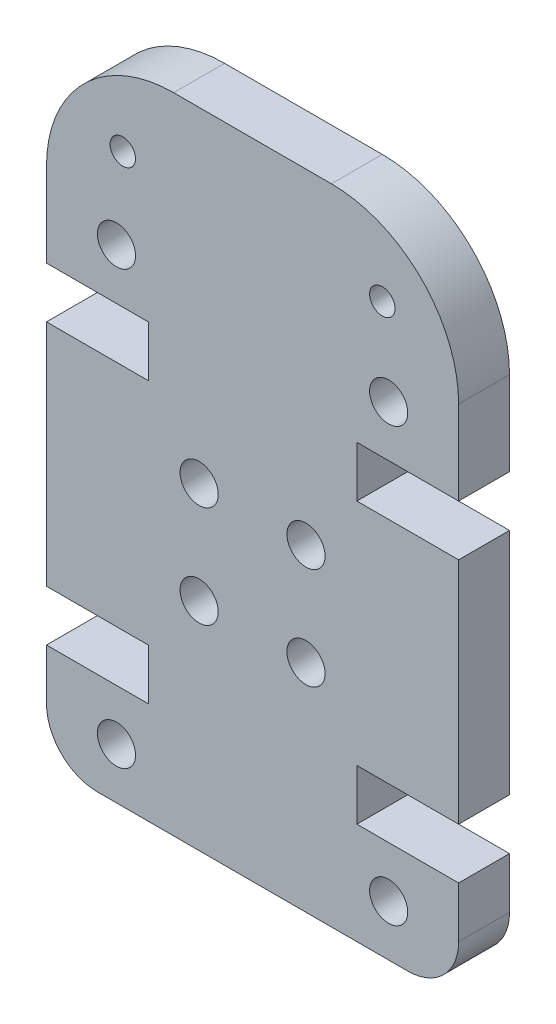
ISO-10303-21;
HEADER;
FILE_DESCRIPTION(('STEP AP214'),'2;1');
FILE_NAME('part.step','',(''),(''),'','','');
FILE_SCHEMA(('AUTOMOTIVE_DESIGN { 1 0 10303 214 1 1 1 1 }'));
ENDSEC;
DATA;
#1=APPLICATION_CONTEXT('core data for automotive mechanical design processes');
#2=APPLICATION_PROTOCOL_DEFINITION('international standard','automotive_design',2000,#1);
#3=PRODUCT_CONTEXT('',#1,'mechanical');
#4=PRODUCT('Part','Part','',(#3));
#5=PRODUCT_RELATED_PRODUCT_CATEGORY('part','',(#4));
#6=PRODUCT_DEFINITION_FORMATION('','',#4);
#7=PRODUCT_DEFINITION_CONTEXT('part definition',#1,'design');
#8=PRODUCT_DEFINITION('design','',#6,#7);
#9=PRODUCT_DEFINITION_SHAPE('','',#8);
#10=(LENGTH_UNIT() NAMED_UNIT(*) SI_UNIT(.MILLI.,.METRE.));
#11=(NAMED_UNIT(*) PLANE_ANGLE_UNIT() SI_UNIT($,.RADIAN.));
#12=(NAMED_UNIT(*) SI_UNIT($,.STERADIAN.) SOLID_ANGLE_UNIT());
#13=UNCERTAINTY_MEASURE_WITH_UNIT(LENGTH_MEASURE(1.E-05),#10,'distance_accuracy_value','');
#14=(GEOMETRIC_REPRESENTATION_CONTEXT(3) GLOBAL_UNCERTAINTY_ASSIGNED_CONTEXT((#13)) GLOBAL_UNIT_ASSIGNED_CONTEXT((#10,
#11,#12)) REPRESENTATION_CONTEXT('',''));
#15=CARTESIAN_POINT('',(0.,0.,0.));
#16=DIRECTION('',(0.,0.,1.));
#17=DIRECTION('',(1.,0.,0.));
#18=AXIS2_PLACEMENT_3D('',#15,#16,#17);
#19=CARTESIAN_POINT('',(5.00000000001794,20.3,2.));
#20=DIRECTION('',(0.,0.,1.));
#21=DIRECTION('',(1.,0.,0.));
#22=AXIS2_PLACEMENT_3D('',#19,#20,#21);
#23=PLANE('',#22);
#24=CARTESIAN_POINT('',(13.4500000000044,1.99999999999792,2.));
#25=DIRECTION('',(0.,0.,1.));
#26=DIRECTION('',(1.,0.,0.));
#27=AXIS2_PLACEMENT_3D('',#24,#25,#26);
#28=CIRCLE('',#27,0.750000000000005);
#29=CARTESIAN_POINT('',(14.2000000000044,1.99999999999792,2.));
#30=VERTEX_POINT('',#29);
#31=EDGE_CURVE('E471',#30,#30,#28,.T.);
#32=ORIENTED_EDGE('',*,*,#31,.F.);
#33=EDGE_LOOP('',(#32));
#34=FACE_BOUND('',#33,.T.);
#35=CARTESIAN_POINT('',(3.00000000000323,22.2999999999968,2.));
#36=DIRECTION('',(0.,0.,1.));
#37=DIRECTION('',(1.,0.,0.));
#38=AXIS2_PLACEMENT_3D('',#35,#36,#37);
#39=CIRCLE('',#38,0.499999999999945);
#40=CARTESIAN_POINT('',(3.50000000000318,22.2999999999968,2.));
#41=VERTEX_POINT('',#40);
#42=EDGE_CURVE('E483',#41,#41,#39,.T.);
#43=ORIENTED_EDGE('',*,*,#42,.F.);
#44=EDGE_LOOP('',(#43));
#45=FACE_BOUND('',#44,.T.);
#46=CARTESIAN_POINT('',(10.2000000000012,12.5000000000022,2.));
#47=DIRECTION('',(0.,0.,1.));
#48=DIRECTION('',(-1.,0.,0.));
#49=AXIS2_PLACEMENT_3D('',#46,#47,#48);
#50=CIRCLE('',#49,0.749999999999999);
#51=CARTESIAN_POINT('',(9.45000000000123,12.5000000000022,2.));
#52=VERTEX_POINT('',#51);
#53=EDGE_CURVE('E495',#52,#52,#50,.T.);
#54=ORIENTED_EDGE('',*,*,#53,.F.);
#55=EDGE_LOOP('',(#54));
#56=FACE_BOUND('',#55,.T.);
#57=CARTESIAN_POINT('',(2.75000000000315,19.0000000000042,2.));
#58=DIRECTION('',(0.,0.,1.));
#59=DIRECTION('',(-1.,0.,0.));
#60=AXIS2_PLACEMENT_3D('',#57,#58,#59);
#61=CIRCLE('',#60,0.749999999999999);
#62=CARTESIAN_POINT('',(2.00000000000315,19.0000000000042,2.));
#63=VERTEX_POINT('',#62);
#64=EDGE_CURVE('E507',#63,#63,#61,.T.);
#65=ORIENTED_EDGE('',*,*,#64,.F.);
#66=EDGE_LOOP('',(#65));
#67=FACE_BOUND('',#66,.T.);
#68=CARTESIAN_POINT('',(10.2000000000012,8.5000000000022,2.));
#69=DIRECTION('',(0.,0.,1.));
#70=DIRECTION('',(1.,0.,0.));
#71=AXIS2_PLACEMENT_3D('',#68,#69,#70);
#72=CIRCLE('',#71,0.749999999999999);
#73=CARTESIAN_POINT('',(10.9500000000012,8.5000000000022,2.));
#74=VERTEX_POINT('',#73);
#75=EDGE_CURVE('E229',#74,#74,#72,.T.);
#76=ORIENTED_EDGE('',*,*,#75,.F.);
#77=EDGE_LOOP('',(#76));
#78=FACE_BOUND('',#77,.T.);
#79=DIRECTION('',(1.,0.,0.));
#80=VECTOR('',#79,1.);
#81=CARTESIAN_POINT('',(4.00000000002053,17.0000000000044,2.));
#82=LINE('',#81,#80);
#83=CARTESIAN_POINT('',(1.79266324007443E-11,17.0000000000044,2.));
#84=VERTEX_POINT('',#83);
#85=CARTESIAN_POINT('',(4.00000000002053,17.0000000000044,2.));
#86=VERTEX_POINT('',#85);
#87=EDGE_CURVE('E272',#84,#86,#82,.T.);
#88=ORIENTED_EDGE('',*,*,#87,.T.);
#89=DIRECTION('',(0.,-1.,0.));
#90=VECTOR('',#89,1.);
#91=CARTESIAN_POINT('',(4.00000000002053,15.0000000000043,2.));
#92=LINE('',#91,#90);
#93=CARTESIAN_POINT('',(4.00000000002053,15.0000000000043,2.));
#94=VERTEX_POINT('',#93);
#95=EDGE_CURVE('E140',#86,#94,#92,.T.);
#96=ORIENTED_EDGE('',*,*,#95,.T.);
#97=DIRECTION('',(-1.,0.,0.));
#98=VECTOR('',#97,1.);
#99=CARTESIAN_POINT('',(1.79196935068404E-11,15.0000000000043,2.));
#100=LINE('',#99,#98);
#101=CARTESIAN_POINT('',(1.79196935068404E-11,15.0000000000043,2.));
#102=VERTEX_POINT('',#101);
#103=EDGE_CURVE('E335',#94,#102,#100,.T.);
#104=ORIENTED_EDGE('',*,*,#103,.T.);
#105=DIRECTION('',(0.,-1.,0.));
#106=VECTOR('',#105,1.);
#107=CARTESIAN_POINT('',(1.79196935068404E-11,6.00000000000009,2.));
#108=LINE('',#107,#106);
#109=CARTESIAN_POINT('',(1.79196935068404E-11,6.00000000000009,2.));
#110=VERTEX_POINT('',#109);
#111=EDGE_CURVE('E354',#102,#110,#108,.T.);
#112=ORIENTED_EDGE('',*,*,#111,.T.);
#113=DIRECTION('',(1.,0.,0.));
#114=VECTOR('',#113,1.);
#115=CARTESIAN_POINT('',(1.79196935068404E-11,6.00000000000009,2.));
#116=LINE('',#115,#114);
#117=CARTESIAN_POINT('',(4.00000000002053,6.00000000000009,2.));
#118=VERTEX_POINT('',#117);
#119=EDGE_CURVE('E351',#110,#118,#116,.T.);
#120=ORIENTED_EDGE('',*,*,#119,.T.);
#121=DIRECTION('',(0.,-1.,0.));
#122=VECTOR('',#121,1.);
#123=CARTESIAN_POINT('',(4.00000000002053,6.00000000000009,2.));
#124=LINE('',#123,#122);
#125=CARTESIAN_POINT('',(4.00000000002053,4.,2.));
#126=VERTEX_POINT('',#125);
#127=EDGE_CURVE('E353',#118,#126,#124,.T.);
#128=ORIENTED_EDGE('',*,*,#127,.T.);
#129=DIRECTION('',(-1.,0.,0.));
#130=VECTOR('',#129,1.);
#131=CARTESIAN_POINT('',(4.00000000002053,4.,2.));
#132=LINE('',#131,#130);
#133=CARTESIAN_POINT('',(0.,4.,2.));
#134=VERTEX_POINT('',#133);
#135=EDGE_CURVE('E356',#126,#134,#132,.T.);
#136=ORIENTED_EDGE('',*,*,#135,.T.);
#137=DIRECTION('',(0.,-1.,0.));
#138=VECTOR('',#137,1.);
#139=CARTESIAN_POINT('',(0.,2.00000000000003,2.));
#140=LINE('',#139,#138);
#141=CARTESIAN_POINT('',(0.,2.00000000000003,2.));
#142=VERTEX_POINT('',#141);
#143=EDGE_CURVE('E362',#134,#142,#140,.T.);
#144=ORIENTED_EDGE('',*,*,#143,.T.);
#145=CARTESIAN_POINT('',(2.00000000000001,2.00000000000003,2.));
#146=DIRECTION('',(0.,0.,1.));
#147=DIRECTION('',(1.,0.,0.));
#148=AXIS2_PLACEMENT_3D('',#145,#146,#147);
#149=CIRCLE('',#148,2.00000000000001);
#150=CARTESIAN_POINT('',(2.00000000000001,0.,2.));
#151=VERTEX_POINT('',#150);
#152=EDGE_CURVE('E364',#142,#151,#149,.T.);
#153=ORIENTED_EDGE('',*,*,#152,.T.);
#154=DIRECTION('',(1.,0.,0.));
#155=VECTOR('',#154,1.);
#156=CARTESIAN_POINT('',(2.00000000000001,0.,2.));
#157=LINE('',#156,#155);
#158=CARTESIAN_POINT('',(14.2000000000169,0.,2.));
#159=VERTEX_POINT('',#158);
#160=EDGE_CURVE('E366',#151,#159,#157,.T.);
#161=ORIENTED_EDGE('',*,*,#160,.T.);
#162=CARTESIAN_POINT('',(14.2000000000208,1.99999999999999,2.));
#163=DIRECTION('',(0.,0.,1.));
#164=DIRECTION('',(1.,0.,0.));
#165=AXIS2_PLACEMENT_3D('',#162,#163,#164);
#166=CIRCLE('',#165,1.99999999999998);
#167=CARTESIAN_POINT('',(16.2000000000208,2.00000000000138,2.));
#168=VERTEX_POINT('',#167);
#169=EDGE_CURVE('E368',#159,#168,#166,.T.);
#170=ORIENTED_EDGE('',*,*,#169,.T.);
#171=DIRECTION('',(0.,1.,0.));
#172=VECTOR('',#171,1.);
#173=CARTESIAN_POINT('',(16.2000000000208,2.00000000000138,2.));
#174=LINE('',#173,#172);
#175=CARTESIAN_POINT('',(16.2000000000208,4.00000000000158,2.));
#176=VERTEX_POINT('',#175);
#177=EDGE_CURVE('E370',#168,#176,#174,.T.);
#178=ORIENTED_EDGE('',*,*,#177,.T.);
#179=DIRECTION('',(-1.,0.,0.));
#180=VECTOR('',#179,1.);
#181=CARTESIAN_POINT('',(12.2000000000197,4.00000000000158,2.));
#182=LINE('',#181,#180);
#183=CARTESIAN_POINT('',(12.2000000000197,4.00000000000158,2.));
#184=VERTEX_POINT('',#183);
#185=EDGE_CURVE('E372',#176,#184,#182,.T.);
#186=ORIENTED_EDGE('',*,*,#185,.T.);
#187=DIRECTION('',(0.,1.,0.));
#188=VECTOR('',#187,1.);
#189=CARTESIAN_POINT('',(12.2000000000197,6.00000000000158,2.));
#190=LINE('',#189,#188);
#191=CARTESIAN_POINT('',(12.2000000000197,6.00000000000158,2.));
#192=VERTEX_POINT('',#191);
#193=EDGE_CURVE('E374',#184,#192,#190,.T.);
#194=ORIENTED_EDGE('',*,*,#193,.T.);
#195=DIRECTION('',(1.,0.,0.));
#196=VECTOR('',#195,1.);
#197=CARTESIAN_POINT('',(16.2000000000197,6.00000000000158,2.));
#198=LINE('',#197,#196);
#199=CARTESIAN_POINT('',(16.2000000000197,6.00000000000158,2.));
#200=VERTEX_POINT('',#199);
#201=EDGE_CURVE('E376',#192,#200,#198,.T.);
#202=ORIENTED_EDGE('',*,*,#201,.T.);
#203=DIRECTION('',(0.,1.,0.));
#204=VECTOR('',#203,1.);
#205=CARTESIAN_POINT('',(16.2000000000197,6.00000000000158,2.));
#206=LINE('',#205,#204);
#207=CARTESIAN_POINT('',(16.2000000000197,15.0000000000028,2.));
#208=VERTEX_POINT('',#207);
#209=EDGE_CURVE('E378',#200,#208,#206,.T.);
#210=ORIENTED_EDGE('',*,*,#209,.T.);
#211=DIRECTION('',(-1.,0.,0.));
#212=VECTOR('',#211,1.);
#213=CARTESIAN_POINT('',(16.2000000000197,15.0000000000028,2.));
#214=LINE('',#213,#212);
#215=CARTESIAN_POINT('',(12.2000000000197,15.0000000000028,2.));
#216=VERTEX_POINT('',#215);
#217=EDGE_CURVE('E380',#208,#216,#214,.T.);
#218=ORIENTED_EDGE('',*,*,#217,.T.);
#219=DIRECTION('',(0.,1.,0.));
#220=VECTOR('',#219,1.);
#221=CARTESIAN_POINT('',(12.2000000000197,15.0000000000028,2.));
#222=LINE('',#221,#220);
#223=CARTESIAN_POINT('',(12.2000000000197,17.0000000000028,2.));
#224=VERTEX_POINT('',#223);
#225=EDGE_CURVE('E382',#216,#224,#222,.T.);
#226=ORIENTED_EDGE('',*,*,#225,.T.);
#227=DIRECTION('',(1.,0.,0.));
#228=VECTOR('',#227,1.);
#229=CARTESIAN_POINT('',(12.2000000000197,17.0000000000028,2.));
#230=LINE('',#229,#228);
#231=CARTESIAN_POINT('',(16.2000000000194,17.0000000000028,2.));
#232=VERTEX_POINT('',#231);
#233=EDGE_CURVE('E384',#224,#232,#230,.T.);
#234=ORIENTED_EDGE('',*,*,#233,.T.);
#235=DIRECTION('',(0.,1.,0.));
#236=VECTOR('',#235,1.);
#237=CARTESIAN_POINT('',(16.2000000000194,20.3,2.));
#238=LINE('',#237,#236);
#239=CARTESIAN_POINT('',(16.2000000000194,20.3,2.));
#240=VERTEX_POINT('',#239);
#241=EDGE_CURVE('E386',#232,#240,#238,.T.);
#242=ORIENTED_EDGE('',*,*,#241,.T.);
#243=CARTESIAN_POINT('',(11.2000000000194,20.3,2.));
#244=DIRECTION('',(0.,0.,1.));
#245=DIRECTION('',(1.,0.,0.));
#246=AXIS2_PLACEMENT_3D('',#243,#244,#245);
#247=CIRCLE('',#246,5.00000000000002);
#248=CARTESIAN_POINT('',(11.2000000000208,25.3,2.));
#249=VERTEX_POINT('',#248);
#250=EDGE_CURVE('E207',#240,#249,#247,.T.);
#251=ORIENTED_EDGE('',*,*,#250,.T.);
#252=DIRECTION('',(-1.,0.,0.));
#253=VECTOR('',#252,1.);
#254=CARTESIAN_POINT('',(5.00000000001842,25.3,2.));
#255=LINE('',#254,#253);
#256=CARTESIAN_POINT('',(5.00000000001842,25.3,2.));
#257=VERTEX_POINT('',#256);
#258=EDGE_CURVE('E201',#249,#257,#255,.T.);
#259=ORIENTED_EDGE('',*,*,#258,.T.);
#260=CARTESIAN_POINT('',(5.00000000001794,20.3,2.));
#261=DIRECTION('',(0.,0.,1.));
#262=DIRECTION('',(1.,0.,0.));
#263=AXIS2_PLACEMENT_3D('',#260,#261,#262);
#264=CIRCLE('',#263,5.00000000000002);
#265=CARTESIAN_POINT('',(1.79266324007443E-11,20.3,2.));
#266=VERTEX_POINT('',#265);
#267=EDGE_CURVE('E205',#257,#266,#264,.T.);
#268=ORIENTED_EDGE('',*,*,#267,.T.);
#269=DIRECTION('',(0.,-1.,0.));
#270=VECTOR('',#269,1.);
#271=CARTESIAN_POINT('',(1.79266324007443E-11,20.3,2.));
#272=LINE('',#271,#270);
#273=EDGE_CURVE('E49',#266,#84,#272,.T.);
#274=ORIENTED_EDGE('',*,*,#273,.T.);
#275=EDGE_LOOP('',(#88,#96,#104,#112,#120,#128,#136,#144,#153,#161,#170,#178,#186,#194,#202,
#210,#218,#226,#234,#242,#251,#259,#268,#274));
#276=FACE_BOUND('',#275,.T.);
#277=CARTESIAN_POINT('',(6.00000000000113,8.5000000000022,2.));
#278=DIRECTION('',(0.,0.,1.));
#279=DIRECTION('',(1.,0.,0.));
#280=AXIS2_PLACEMENT_3D('',#277,#278,#279);
#281=CIRCLE('',#280,0.749999999999999);
#282=CARTESIAN_POINT('',(6.75000000000113,8.5000000000022,2.));
#283=VERTEX_POINT('',#282);
#284=EDGE_CURVE('E513',#283,#283,#281,.T.);
#285=ORIENTED_EDGE('',*,*,#284,.F.);
#286=EDGE_LOOP('',(#285));
#287=FACE_BOUND('',#286,.T.);
#288=CARTESIAN_POINT('',(6.00000000000113,12.5000000000022,2.));
#289=DIRECTION('',(0.,0.,1.));
#290=DIRECTION('',(-1.,0.,0.));
#291=AXIS2_PLACEMENT_3D('',#288,#289,#290);
#292=CIRCLE('',#291,0.749999999999999);
#293=CARTESIAN_POINT('',(5.25000000000113,12.5000000000022,2.));
#294=VERTEX_POINT('',#293);
#295=EDGE_CURVE('E501',#294,#294,#292,.T.);
#296=ORIENTED_EDGE('',*,*,#295,.F.);
#297=EDGE_LOOP('',(#296));
#298=FACE_BOUND('',#297,.T.);
#299=CARTESIAN_POINT('',(13.4500000000044,19.0000000000065,2.));
#300=DIRECTION('',(0.,0.,1.));
#301=DIRECTION('',(-1.,0.,0.));
#302=AXIS2_PLACEMENT_3D('',#299,#300,#301);
#303=CIRCLE('',#302,0.750000000000005);
#304=CARTESIAN_POINT('',(12.7000000000044,19.0000000000065,2.));
#305=VERTEX_POINT('',#304);
#306=EDGE_CURVE('E489',#305,#305,#303,.T.);
#307=ORIENTED_EDGE('',*,*,#306,.F.);
#308=EDGE_LOOP('',(#307));
#309=FACE_BOUND('',#308,.T.);
#310=CARTESIAN_POINT('',(13.2000000000036,22.2999999999968,2.));
#311=DIRECTION('',(0.,0.,1.));
#312=DIRECTION('',(1.,0.,0.));
#313=AXIS2_PLACEMENT_3D('',#310,#311,#312);
#314=CIRCLE('',#313,0.500000000000167);
#315=CARTESIAN_POINT('',(13.7000000000037,22.2999999999968,2.));
#316=VERTEX_POINT('',#315);
#317=EDGE_CURVE('E477',#316,#316,#314,.T.);
#318=ORIENTED_EDGE('',*,*,#317,.F.);
#319=EDGE_LOOP('',(#318));
#320=FACE_BOUND('',#319,.T.);
#321=CARTESIAN_POINT('',(2.75000000000315,2.00000000000025,2.));
#322=DIRECTION('',(0.,0.,1.));
#323=DIRECTION('',(1.,0.,0.));
#324=AXIS2_PLACEMENT_3D('',#321,#322,#323);
#325=CIRCLE('',#324,0.749999999999999);
#326=CARTESIAN_POINT('',(3.50000000000315,2.00000000000025,2.));
#327=VERTEX_POINT('',#326);
#328=EDGE_CURVE('E462',#327,#327,#325,.T.);
#329=ORIENTED_EDGE('',*,*,#328,.F.);
#330=EDGE_LOOP('',(#329));
#331=FACE_BOUND('',#330,.T.);
#332=ADVANCED_FACE('F32',(#34,#45,#56,#67,#78,#276,#287,#298,#309,#320,#331),#23,.T.);
#333=CARTESIAN_POINT('',(5.00000000001794,20.3,0.));
#334=DIRECTION('',(0.,0.,1.));
#335=DIRECTION('',(1.,0.,0.));
#336=AXIS2_PLACEMENT_3D('',#333,#334,#335);
#337=PLANE('',#336);
#338=CARTESIAN_POINT('',(13.4500000000044,1.99999999999792,0.));
#339=DIRECTION('',(0.,0.,1.));
#340=DIRECTION('',(1.,0.,0.));
#341=AXIS2_PLACEMENT_3D('',#338,#339,#340);
#342=CIRCLE('',#341,0.750000000000005);
#343=CARTESIAN_POINT('',(14.2000000000044,1.99999999999792,0.));
#344=VERTEX_POINT('',#343);
#345=EDGE_CURVE('E468',#344,#344,#342,.T.);
#346=ORIENTED_EDGE('',*,*,#345,.T.);
#347=EDGE_LOOP('',(#346));
#348=FACE_BOUND('',#347,.T.);
#349=CARTESIAN_POINT('',(3.00000000000323,22.2999999999968,0.));
#350=DIRECTION('',(0.,0.,1.));
#351=DIRECTION('',(1.,0.,0.));
#352=AXIS2_PLACEMENT_3D('',#349,#350,#351);
#353=CIRCLE('',#352,0.499999999999945);
#354=CARTESIAN_POINT('',(3.50000000000318,22.2999999999968,0.));
#355=VERTEX_POINT('',#354);
#356=EDGE_CURVE('E480',#355,#355,#353,.T.);
#357=ORIENTED_EDGE('',*,*,#356,.T.);
#358=EDGE_LOOP('',(#357));
#359=FACE_BOUND('',#358,.T.);
#360=CARTESIAN_POINT('',(10.2000000000012,12.5000000000022,0.));
#361=DIRECTION('',(0.,0.,1.));
#362=DIRECTION('',(-1.,0.,0.));
#363=AXIS2_PLACEMENT_3D('',#360,#361,#362);
#364=CIRCLE('',#363,0.749999999999999);
#365=CARTESIAN_POINT('',(9.45000000000123,12.5000000000022,0.));
#366=VERTEX_POINT('',#365);
#367=EDGE_CURVE('E492',#366,#366,#364,.T.);
#368=ORIENTED_EDGE('',*,*,#367,.T.);
#369=EDGE_LOOP('',(#368));
#370=FACE_BOUND('',#369,.T.);
#371=CARTESIAN_POINT('',(2.75000000000315,19.0000000000042,0.));
#372=DIRECTION('',(0.,0.,1.));
#373=DIRECTION('',(-1.,0.,0.));
#374=AXIS2_PLACEMENT_3D('',#371,#372,#373);
#375=CIRCLE('',#374,0.749999999999999);
#376=CARTESIAN_POINT('',(2.00000000000315,19.0000000000042,0.));
#377=VERTEX_POINT('',#376);
#378=EDGE_CURVE('E504',#377,#377,#375,.T.);
#379=ORIENTED_EDGE('',*,*,#378,.T.);
#380=EDGE_LOOP('',(#379));
#381=FACE_BOUND('',#380,.T.);
#382=CARTESIAN_POINT('',(10.2000000000012,8.5000000000022,0.));
#383=DIRECTION('',(0.,0.,1.));
#384=DIRECTION('',(1.,0.,0.));
#385=AXIS2_PLACEMENT_3D('',#382,#383,#384);
#386=CIRCLE('',#385,0.749999999999999);
#387=CARTESIAN_POINT('',(10.9500000000012,8.5000000000022,0.));
#388=VERTEX_POINT('',#387);
#389=EDGE_CURVE('E516',#388,#388,#386,.T.);
#390=ORIENTED_EDGE('',*,*,#389,.T.);
#391=EDGE_LOOP('',(#390));
#392=FACE_BOUND('',#391,.T.);
#393=DIRECTION('',(1.,0.,0.));
#394=VECTOR('',#393,1.);
#395=CARTESIAN_POINT('',(4.00000000002053,17.0000000000044,0.));
#396=LINE('',#395,#394);
#397=CARTESIAN_POINT('',(1.79266324007443E-11,17.0000000000044,0.));
#398=VERTEX_POINT('',#397);
#399=CARTESIAN_POINT('',(4.00000000002053,17.0000000000044,0.));
#400=VERTEX_POINT('',#399);
#401=EDGE_CURVE('E225',#398,#400,#396,.T.);
#402=ORIENTED_EDGE('',*,*,#401,.F.);
#403=DIRECTION('',(0.,-1.,0.));
#404=VECTOR('',#403,1.);
#405=CARTESIAN_POINT('',(1.79266324007443E-11,20.3,0.));
#406=LINE('',#405,#404);
#407=CARTESIAN_POINT('',(1.79266324007443E-11,20.3,0.));
#408=VERTEX_POINT('',#407);
#409=EDGE_CURVE('E132',#408,#398,#406,.T.);
#410=ORIENTED_EDGE('',*,*,#409,.F.);
#411=CARTESIAN_POINT('',(5.00000000001794,20.3,0.));
#412=DIRECTION('',(0.,0.,1.));
#413=DIRECTION('',(1.,0.,0.));
#414=AXIS2_PLACEMENT_3D('',#411,#412,#413);
#415=CIRCLE('',#414,5.00000000000002);
#416=CARTESIAN_POINT('',(5.00000000001842,25.3,0.));
#417=VERTEX_POINT('',#416);
#418=EDGE_CURVE('E126',#417,#408,#415,.T.);
#419=ORIENTED_EDGE('',*,*,#418,.F.);
#420=DIRECTION('',(-1.,0.,0.));
#421=VECTOR('',#420,1.);
#422=CARTESIAN_POINT('',(5.00000000001842,25.3,0.));
#423=LINE('',#422,#421);
#424=CARTESIAN_POINT('',(11.2000000000208,25.3,0.));
#425=VERTEX_POINT('',#424);
#426=EDGE_CURVE('E215',#425,#417,#423,.T.);
#427=ORIENTED_EDGE('',*,*,#426,.F.);
#428=CARTESIAN_POINT('',(11.2000000000194,20.3,0.));
#429=DIRECTION('',(0.,0.,1.));
#430=DIRECTION('',(1.,0.,0.));
#431=AXIS2_PLACEMENT_3D('',#428,#429,#430);
#432=CIRCLE('',#431,5.00000000000002);
#433=CARTESIAN_POINT('',(16.2000000000194,20.3,0.));
#434=VERTEX_POINT('',#433);
#435=EDGE_CURVE('E267',#434,#425,#432,.T.);
#436=ORIENTED_EDGE('',*,*,#435,.F.);
#437=DIRECTION('',(0.,1.,0.));
#438=VECTOR('',#437,1.);
#439=CARTESIAN_POINT('',(16.2000000000194,20.3,0.));
#440=LINE('',#439,#438);
#441=CARTESIAN_POINT('',(16.2000000000194,17.0000000000028,0.));
#442=VERTEX_POINT('',#441);
#443=EDGE_CURVE('E265',#442,#434,#440,.T.);
#444=ORIENTED_EDGE('',*,*,#443,.F.);
#445=DIRECTION('',(1.,0.,0.));
#446=VECTOR('',#445,1.);
#447=CARTESIAN_POINT('',(12.2000000000197,17.0000000000028,0.));
#448=LINE('',#447,#446);
#449=CARTESIAN_POINT('',(12.2000000000197,17.0000000000028,0.));
#450=VERTEX_POINT('',#449);
#451=EDGE_CURVE('E263',#450,#442,#448,.T.);
#452=ORIENTED_EDGE('',*,*,#451,.F.);
#453=DIRECTION('',(0.,1.,0.));
#454=VECTOR('',#453,1.);
#455=CARTESIAN_POINT('',(12.2000000000197,15.0000000000028,0.));
#456=LINE('',#455,#454);
#457=CARTESIAN_POINT('',(12.2000000000197,15.0000000000028,0.));
#458=VERTEX_POINT('',#457);
#459=EDGE_CURVE('E261',#458,#450,#456,.T.);
#460=ORIENTED_EDGE('',*,*,#459,.F.);
#461=DIRECTION('',(-1.,0.,0.));
#462=VECTOR('',#461,1.);
#463=CARTESIAN_POINT('',(16.2000000000197,15.0000000000028,0.));
#464=LINE('',#463,#462);
#465=CARTESIAN_POINT('',(16.2000000000197,15.0000000000028,0.));
#466=VERTEX_POINT('',#465);
#467=EDGE_CURVE('E259',#466,#458,#464,.T.);
#468=ORIENTED_EDGE('',*,*,#467,.F.);
#469=DIRECTION('',(0.,1.,0.));
#470=VECTOR('',#469,1.);
#471=CARTESIAN_POINT('',(16.2000000000197,6.00000000000158,0.));
#472=LINE('',#471,#470);
#473=CARTESIAN_POINT('',(16.2000000000197,6.00000000000158,0.));
#474=VERTEX_POINT('',#473);
#475=EDGE_CURVE('E257',#474,#466,#472,.T.);
#476=ORIENTED_EDGE('',*,*,#475,.F.);
#477=DIRECTION('',(1.,0.,0.));
#478=VECTOR('',#477,1.);
#479=CARTESIAN_POINT('',(16.2000000000197,6.00000000000158,0.));
#480=LINE('',#479,#478);
#481=CARTESIAN_POINT('',(12.2000000000197,6.00000000000158,0.));
#482=VERTEX_POINT('',#481);
#483=EDGE_CURVE('E255',#482,#474,#480,.T.);
#484=ORIENTED_EDGE('',*,*,#483,.F.);
#485=DIRECTION('',(0.,1.,0.));
#486=VECTOR('',#485,1.);
#487=CARTESIAN_POINT('',(12.2000000000197,6.00000000000158,0.));
#488=LINE('',#487,#486);
#489=CARTESIAN_POINT('',(12.2000000000197,4.00000000000158,0.));
#490=VERTEX_POINT('',#489);
#491=EDGE_CURVE('E253',#490,#482,#488,.T.);
#492=ORIENTED_EDGE('',*,*,#491,.F.);
#493=DIRECTION('',(-1.,0.,0.));
#494=VECTOR('',#493,1.);
#495=CARTESIAN_POINT('',(12.2000000000197,4.00000000000158,0.));
#496=LINE('',#495,#494);
#497=CARTESIAN_POINT('',(16.2000000000208,4.00000000000158,0.));
#498=VERTEX_POINT('',#497);
#499=EDGE_CURVE('E251',#498,#490,#496,.T.);
#500=ORIENTED_EDGE('',*,*,#499,.F.);
#501=DIRECTION('',(0.,1.,0.));
#502=VECTOR('',#501,1.);
#503=CARTESIAN_POINT('',(16.2000000000208,2.00000000000138,0.));
#504=LINE('',#503,#502);
#505=CARTESIAN_POINT('',(16.2000000000208,2.00000000000138,0.));
#506=VERTEX_POINT('',#505);
#507=EDGE_CURVE('E249',#506,#498,#504,.T.);
#508=ORIENTED_EDGE('',*,*,#507,.F.);
#509=CARTESIAN_POINT('',(14.2000000000208,1.99999999999999,0.));
#510=DIRECTION('',(0.,0.,1.));
#511=DIRECTION('',(1.,0.,0.));
#512=AXIS2_PLACEMENT_3D('',#509,#510,#511);
#513=CIRCLE('',#512,1.99999999999998);
#514=CARTESIAN_POINT('',(14.2000000000169,0.,0.));
#515=VERTEX_POINT('',#514);
#516=EDGE_CURVE('E247',#515,#506,#513,.T.);
#517=ORIENTED_EDGE('',*,*,#516,.F.);
#518=DIRECTION('',(1.,0.,0.));
#519=VECTOR('',#518,1.);
#520=CARTESIAN_POINT('',(2.00000000000001,0.,0.));
#521=LINE('',#520,#519);
#522=CARTESIAN_POINT('',(2.00000000000001,0.,0.));
#523=VERTEX_POINT('',#522);
#524=EDGE_CURVE('E245',#523,#515,#521,.T.);
#525=ORIENTED_EDGE('',*,*,#524,.F.);
#526=CARTESIAN_POINT('',(2.00000000000001,2.00000000000003,0.));
#527=DIRECTION('',(0.,0.,1.));
#528=DIRECTION('',(1.,0.,0.));
#529=AXIS2_PLACEMENT_3D('',#526,#527,#528);
#530=CIRCLE('',#529,2.00000000000001);
#531=CARTESIAN_POINT('',(0.,2.00000000000003,0.));
#532=VERTEX_POINT('',#531);
#533=EDGE_CURVE('E243',#532,#523,#530,.T.);
#534=ORIENTED_EDGE('',*,*,#533,.F.);
#535=DIRECTION('',(0.,-1.,0.));
#536=VECTOR('',#535,1.);
#537=CARTESIAN_POINT('',(0.,2.00000000000003,0.));
#538=LINE('',#537,#536);
#539=CARTESIAN_POINT('',(0.,4.,0.));
#540=VERTEX_POINT('',#539);
#541=EDGE_CURVE('E241',#540,#532,#538,.T.);
#542=ORIENTED_EDGE('',*,*,#541,.F.);
#543=DIRECTION('',(-1.,0.,0.));
#544=VECTOR('',#543,1.);
#545=CARTESIAN_POINT('',(4.00000000002053,4.,0.));
#546=LINE('',#545,#544);
#547=CARTESIAN_POINT('',(4.00000000002053,4.,0.));
#548=VERTEX_POINT('',#547);
#549=EDGE_CURVE('E239',#548,#540,#546,.T.);
#550=ORIENTED_EDGE('',*,*,#549,.F.);
#551=DIRECTION('',(0.,-1.,0.));
#552=VECTOR('',#551,1.);
#553=CARTESIAN_POINT('',(4.00000000002053,6.00000000000009,0.));
#554=LINE('',#553,#552);
#555=CARTESIAN_POINT('',(4.00000000002053,6.00000000000009,0.));
#556=VERTEX_POINT('',#555);
#557=EDGE_CURVE('E237',#556,#548,#554,.T.);
#558=ORIENTED_EDGE('',*,*,#557,.F.);
#559=DIRECTION('',(1.,0.,0.));
#560=VECTOR('',#559,1.);
#561=CARTESIAN_POINT('',(1.79196935068404E-11,6.00000000000009,0.));
#562=LINE('',#561,#560);
#563=CARTESIAN_POINT('',(1.79196935068404E-11,6.00000000000009,0.));
#564=VERTEX_POINT('',#563);
#565=EDGE_CURVE('E235',#564,#556,#562,.T.);
#566=ORIENTED_EDGE('',*,*,#565,.F.);
#567=DIRECTION('',(0.,-1.,0.));
#568=VECTOR('',#567,1.);
#569=CARTESIAN_POINT('',(1.79196935068404E-11,6.00000000000009,0.));
#570=LINE('',#569,#568);
#571=CARTESIAN_POINT('',(1.79196935068404E-11,15.0000000000043,0.));
#572=VERTEX_POINT('',#571);
#573=EDGE_CURVE('E233',#572,#564,#570,.T.);
#574=ORIENTED_EDGE('',*,*,#573,.F.);
#575=DIRECTION('',(-1.,0.,0.));
#576=VECTOR('',#575,1.);
#577=CARTESIAN_POINT('',(1.79196935068404E-11,15.0000000000043,0.));
#578=LINE('',#577,#576);
#579=CARTESIAN_POINT('',(4.00000000002053,15.0000000000043,0.));
#580=VERTEX_POINT('',#579);
#581=EDGE_CURVE('E231',#580,#572,#578,.T.);
#582=ORIENTED_EDGE('',*,*,#581,.F.);
#583=DIRECTION('',(0.,-1.,0.));
#584=VECTOR('',#583,1.);
#585=CARTESIAN_POINT('',(4.00000000002053,15.0000000000043,0.));
#586=LINE('',#585,#584);
#587=EDGE_CURVE('E228',#400,#580,#586,.T.);
#588=ORIENTED_EDGE('',*,*,#587,.F.);
#589=EDGE_LOOP('',(#402,#410,#419,#427,#436,#444,#452,#460,#468,#476,#484,#492,#500,#508,#517,
#525,#534,#542,#550,#558,#566,#574,#582,#588));
#590=FACE_BOUND('',#589,.T.);
#591=CARTESIAN_POINT('',(6.00000000000113,8.5000000000022,0.));
#592=DIRECTION('',(0.,0.,1.));
#593=DIRECTION('',(1.,0.,0.));
#594=AXIS2_PLACEMENT_3D('',#591,#592,#593);
#595=CIRCLE('',#594,0.749999999999999);
#596=CARTESIAN_POINT('',(6.75000000000113,8.5000000000022,0.));
#597=VERTEX_POINT('',#596);
#598=EDGE_CURVE('E510',#597,#597,#595,.T.);
#599=ORIENTED_EDGE('',*,*,#598,.T.);
#600=EDGE_LOOP('',(#599));
#601=FACE_BOUND('',#600,.T.);
#602=CARTESIAN_POINT('',(6.00000000000113,12.5000000000022,0.));
#603=DIRECTION('',(0.,0.,1.));
#604=DIRECTION('',(-1.,0.,0.));
#605=AXIS2_PLACEMENT_3D('',#602,#603,#604);
#606=CIRCLE('',#605,0.749999999999999);
#607=CARTESIAN_POINT('',(5.25000000000113,12.5000000000022,0.));
#608=VERTEX_POINT('',#607);
#609=EDGE_CURVE('E498',#608,#608,#606,.T.);
#610=ORIENTED_EDGE('',*,*,#609,.T.);
#611=EDGE_LOOP('',(#610));
#612=FACE_BOUND('',#611,.T.);
#613=CARTESIAN_POINT('',(13.4500000000044,19.0000000000065,0.));
#614=DIRECTION('',(0.,0.,1.));
#615=DIRECTION('',(-1.,0.,0.));
#616=AXIS2_PLACEMENT_3D('',#613,#614,#615);
#617=CIRCLE('',#616,0.750000000000005);
#618=CARTESIAN_POINT('',(12.7000000000044,19.0000000000065,0.));
#619=VERTEX_POINT('',#618);
#620=EDGE_CURVE('E486',#619,#619,#617,.T.);
#621=ORIENTED_EDGE('',*,*,#620,.T.);
#622=EDGE_LOOP('',(#621));
#623=FACE_BOUND('',#622,.T.);
#624=CARTESIAN_POINT('',(13.2000000000036,22.2999999999968,0.));
#625=DIRECTION('',(0.,0.,1.));
#626=DIRECTION('',(1.,0.,0.));
#627=AXIS2_PLACEMENT_3D('',#624,#625,#626);
#628=CIRCLE('',#627,0.500000000000167);
#629=CARTESIAN_POINT('',(13.7000000000037,22.2999999999968,0.));
#630=VERTEX_POINT('',#629);
#631=EDGE_CURVE('E474',#630,#630,#628,.T.);
#632=ORIENTED_EDGE('',*,*,#631,.T.);
#633=EDGE_LOOP('',(#632));
#634=FACE_BOUND('',#633,.T.);
#635=CARTESIAN_POINT('',(2.75000000000315,2.00000000000025,0.));
#636=DIRECTION('',(0.,0.,1.));
#637=DIRECTION('',(1.,0.,0.));
#638=AXIS2_PLACEMENT_3D('',#635,#636,#637);
#639=CIRCLE('',#638,0.749999999999999);
#640=CARTESIAN_POINT('',(3.50000000000315,2.00000000000025,0.));
#641=VERTEX_POINT('',#640);
#642=EDGE_CURVE('E465',#641,#641,#639,.T.);
#643=ORIENTED_EDGE('',*,*,#642,.T.);
#644=EDGE_LOOP('',(#643));
#645=FACE_BOUND('',#644,.T.);
#646=ADVANCED_FACE('F339',(#348,#359,#370,#381,#392,#590,#601,#612,#623,#634,#645),#337,.F.);
#647=CARTESIAN_POINT('',(4.00000000002053,17.0000000000044,2.));
#648=DIRECTION('',(0.,1.,0.));
#649=DIRECTION('',(0.,0.,1.));
#650=AXIS2_PLACEMENT_3D('',#647,#648,#649);
#651=PLANE('',#650);
#652=ORIENTED_EDGE('',*,*,#401,.T.);
#653=DIRECTION('',(0.,0.,-1.));
#654=VECTOR('',#653,1.);
#655=CARTESIAN_POINT('',(4.00000000002053,17.0000000000044,2.));
#656=LINE('',#655,#654);
#657=EDGE_CURVE('E11',#86,#400,#656,.T.);
#658=ORIENTED_EDGE('',*,*,#657,.F.);
#659=ORIENTED_EDGE('',*,*,#87,.F.);
#660=DIRECTION('',(0.,0.,-1.));
#661=VECTOR('',#660,1.);
#662=CARTESIAN_POINT('',(1.79266324007443E-11,17.0000000000044,2.));
#663=LINE('',#662,#661);
#664=EDGE_CURVE('E221',#84,#398,#663,.T.);
#665=ORIENTED_EDGE('',*,*,#664,.T.);
#666=EDGE_LOOP('',(#652,#658,#659,#665));
#667=FACE_BOUND('',#666,.T.);
#668=ADVANCED_FACE('F34',(#667),#651,.F.);
#669=CARTESIAN_POINT('',(4.00000000002053,15.0000000000043,2.));
#670=DIRECTION('',(1.,0.,0.));
#671=DIRECTION('',(0.,0.,-1.));
#672=AXIS2_PLACEMENT_3D('',#669,#670,#671);
#673=PLANE('',#672);
#674=ORIENTED_EDGE('',*,*,#587,.T.);
#675=DIRECTION('',(0.,0.,-1.));
#676=VECTOR('',#675,1.);
#677=CARTESIAN_POINT('',(4.00000000002053,15.0000000000043,2.));
#678=LINE('',#677,#676);
#679=EDGE_CURVE('E41',#94,#580,#678,.T.);
#680=ORIENTED_EDGE('',*,*,#679,.F.);
#681=ORIENTED_EDGE('',*,*,#95,.F.);
#682=ORIENTED_EDGE('',*,*,#657,.T.);
#683=EDGE_LOOP('',(#674,#680,#681,#682));
#684=FACE_BOUND('',#683,.T.);
#685=ADVANCED_FACE('F799',(#684),#673,.F.);
#686=CARTESIAN_POINT('',(1.79196935068404E-11,15.0000000000043,2.));
#687=DIRECTION('',(0.,-1.,0.));
#688=DIRECTION('',(0.,0.,-1.));
#689=AXIS2_PLACEMENT_3D('',#686,#687,#688);
#690=PLANE('',#689);
#691=ORIENTED_EDGE('',*,*,#581,.T.);
#692=DIRECTION('',(0.,0.,-1.));
#693=VECTOR('',#692,1.);
#694=CARTESIAN_POINT('',(1.79196935068404E-11,15.0000000000043,2.));
#695=LINE('',#694,#693);
#696=EDGE_CURVE('E327',#102,#572,#695,.T.);
#697=ORIENTED_EDGE('',*,*,#696,.F.);
#698=ORIENTED_EDGE('',*,*,#103,.F.);
#699=ORIENTED_EDGE('',*,*,#679,.T.);
#700=EDGE_LOOP('',(#691,#697,#698,#699));
#701=FACE_BOUND('',#700,.T.);
#702=ADVANCED_FACE('F333',(#701),#690,.F.);
#703=CARTESIAN_POINT('',(1.79196935068404E-11,6.00000000000009,2.));
#704=DIRECTION('',(1.,0.,0.));
#705=DIRECTION('',(0.,0.,-1.));
#706=AXIS2_PLACEMENT_3D('',#703,#704,#705);
#707=PLANE('',#706);
#708=ORIENTED_EDGE('',*,*,#573,.T.);
#709=DIRECTION('',(0.,0.,-1.));
#710=VECTOR('',#709,1.);
#711=CARTESIAN_POINT('',(1.79196935068404E-11,6.00000000000009,2.));
#712=LINE('',#711,#710);
#713=EDGE_CURVE('E324',#110,#564,#712,.T.);
#714=ORIENTED_EDGE('',*,*,#713,.F.);
#715=ORIENTED_EDGE('',*,*,#111,.F.);
#716=ORIENTED_EDGE('',*,*,#696,.T.);
#717=EDGE_LOOP('',(#708,#714,#715,#716));
#718=FACE_BOUND('',#717,.T.);
#719=ADVANCED_FACE('F345',(#718),#707,.F.);
#720=CARTESIAN_POINT('',(1.79196935068404E-11,6.00000000000009,2.));
#721=DIRECTION('',(0.,1.,0.));
#722=DIRECTION('',(0.,0.,1.));
#723=AXIS2_PLACEMENT_3D('',#720,#721,#722);
#724=PLANE('',#723);
#725=ORIENTED_EDGE('',*,*,#565,.T.);
#726=DIRECTION('',(0.,0.,-1.));
#727=VECTOR('',#726,1.);
#728=CARTESIAN_POINT('',(4.00000000002053,6.00000000000009,2.));
#729=LINE('',#728,#727);
#730=EDGE_CURVE('E321',#118,#556,#729,.T.);
#731=ORIENTED_EDGE('',*,*,#730,.F.);
#732=ORIENTED_EDGE('',*,*,#119,.F.);
#733=ORIENTED_EDGE('',*,*,#713,.T.);
#734=EDGE_LOOP('',(#725,#731,#732,#733));
#735=FACE_BOUND('',#734,.T.);
#736=ADVANCED_FACE('F349',(#735),#724,.F.);
#737=CARTESIAN_POINT('',(4.00000000002053,6.00000000000009,2.));
#738=DIRECTION('',(1.,0.,0.));
#739=DIRECTION('',(0.,0.,-1.));
#740=AXIS2_PLACEMENT_3D('',#737,#738,#739);
#741=PLANE('',#740);
#742=ORIENTED_EDGE('',*,*,#557,.T.);
#743=DIRECTION('',(0.,0.,-1.));
#744=VECTOR('',#743,1.);
#745=CARTESIAN_POINT('',(4.00000000002053,4.,2.));
#746=LINE('',#745,#744);
#747=EDGE_CURVE('E318',#126,#548,#746,.T.);
#748=ORIENTED_EDGE('',*,*,#747,.F.);
#749=ORIENTED_EDGE('',*,*,#127,.F.);
#750=ORIENTED_EDGE('',*,*,#730,.T.);
#751=EDGE_LOOP('',(#742,#748,#749,#750));
#752=FACE_BOUND('',#751,.T.);
#753=ADVANCED_FACE('F764',(#752),#741,.F.);
#754=CARTESIAN_POINT('',(4.00000000002053,4.,2.));
#755=DIRECTION('',(0.,-1.,0.));
#756=DIRECTION('',(0.,0.,-1.));
#757=AXIS2_PLACEMENT_3D('',#754,#755,#756);
#758=PLANE('',#757);
#759=ORIENTED_EDGE('',*,*,#549,.T.);
#760=DIRECTION('',(0.,0.,-1.));
#761=VECTOR('',#760,1.);
#762=CARTESIAN_POINT('',(0.,4.,2.));
#763=LINE('',#762,#761);
#764=EDGE_CURVE('E315',#134,#540,#763,.T.);
#765=ORIENTED_EDGE('',*,*,#764,.F.);
#766=ORIENTED_EDGE('',*,*,#135,.F.);
#767=ORIENTED_EDGE('',*,*,#747,.T.);
#768=EDGE_LOOP('',(#759,#765,#766,#767));
#769=FACE_BOUND('',#768,.T.);
#770=ADVANCED_FACE('F754',(#769),#758,.F.);
#771=CARTESIAN_POINT('',(0.,2.00000000000003,2.));
#772=DIRECTION('',(1.,0.,0.));
#773=DIRECTION('',(0.,0.,-1.));
#774=AXIS2_PLACEMENT_3D('',#771,#772,#773);
#775=PLANE('',#774);
#776=ORIENTED_EDGE('',*,*,#541,.T.);
#777=DIRECTION('',(0.,0.,-1.));
#778=VECTOR('',#777,1.);
#779=CARTESIAN_POINT('',(0.,2.00000000000003,2.));
#780=LINE('',#779,#778);
#781=EDGE_CURVE('E312',#142,#532,#780,.T.);
#782=ORIENTED_EDGE('',*,*,#781,.F.);
#783=ORIENTED_EDGE('',*,*,#143,.F.);
#784=ORIENTED_EDGE('',*,*,#764,.T.);
#785=EDGE_LOOP('',(#776,#782,#783,#784));
#786=FACE_BOUND('',#785,.T.);
#787=ADVANCED_FACE('F744',(#786),#775,.F.);
#788=CARTESIAN_POINT('',(2.00000000000001,2.00000000000003,2.));
#789=DIRECTION('',(0.,0.,-1.));
#790=DIRECTION('',(-1.,0.,0.));
#791=AXIS2_PLACEMENT_3D('',#788,#789,#790);
#792=CYLINDRICAL_SURFACE('',#791,2.00000000000001);
#793=ORIENTED_EDGE('',*,*,#533,.T.);
#794=DIRECTION('',(0.,0.,-1.));
#795=VECTOR('',#794,1.);
#796=CARTESIAN_POINT('',(2.00000000000001,0.,2.));
#797=LINE('',#796,#795);
#798=EDGE_CURVE('E309',#151,#523,#797,.T.);
#799=ORIENTED_EDGE('',*,*,#798,.F.);
#800=ORIENTED_EDGE('',*,*,#152,.F.);
#801=ORIENTED_EDGE('',*,*,#781,.T.);
#802=EDGE_LOOP('',(#793,#799,#800,#801));
#803=FACE_BOUND('',#802,.T.);
#804=ADVANCED_FACE('F734',(#803),#792,.T.);
#805=CARTESIAN_POINT('',(2.00000000000001,0.,2.));
#806=DIRECTION('',(0.,1.,0.));
#807=DIRECTION('',(-1.,0.,0.));
#808=AXIS2_PLACEMENT_3D('',#805,#806,#807);
#809=PLANE('',#808);
#810=ORIENTED_EDGE('',*,*,#524,.T.);
#811=DIRECTION('',(0.,0.,-1.));
#812=VECTOR('',#811,1.);
#813=CARTESIAN_POINT('',(14.2000000000169,0.,2.));
#814=LINE('',#813,#812);
#815=EDGE_CURVE('E306',#159,#515,#814,.T.);
#816=ORIENTED_EDGE('',*,*,#815,.F.);
#817=ORIENTED_EDGE('',*,*,#160,.F.);
#818=ORIENTED_EDGE('',*,*,#798,.T.);
#819=EDGE_LOOP('',(#810,#816,#817,#818));
#820=FACE_BOUND('',#819,.T.);
#821=ADVANCED_FACE('F724',(#820),#809,.F.);
#822=CARTESIAN_POINT('',(14.2000000000208,1.99999999999999,2.));
#823=DIRECTION('',(0.,0.,-1.));
#824=DIRECTION('',(-1.,0.,0.));
#825=AXIS2_PLACEMENT_3D('',#822,#823,#824);
#826=CYLINDRICAL_SURFACE('',#825,1.99999999999998);
#827=ORIENTED_EDGE('',*,*,#516,.T.);
#828=DIRECTION('',(0.,0.,-1.));
#829=VECTOR('',#828,1.);
#830=CARTESIAN_POINT('',(16.2000000000208,2.00000000000138,2.));
#831=LINE('',#830,#829);
#832=EDGE_CURVE('E303',#168,#506,#831,.T.);
#833=ORIENTED_EDGE('',*,*,#832,.F.);
#834=ORIENTED_EDGE('',*,*,#169,.F.);
#835=ORIENTED_EDGE('',*,*,#815,.T.);
#836=EDGE_LOOP('',(#827,#833,#834,#835));
#837=FACE_BOUND('',#836,.T.);
#838=ADVANCED_FACE('F714',(#837),#826,.T.);
#839=CARTESIAN_POINT('',(16.2000000000208,2.00000000000138,2.));
#840=DIRECTION('',(-1.,0.,0.));
#841=DIRECTION('',(0.,0.,1.));
#842=AXIS2_PLACEMENT_3D('',#839,#840,#841);
#843=PLANE('',#842);
#844=ORIENTED_EDGE('',*,*,#507,.T.);
#845=DIRECTION('',(0.,0.,-1.));
#846=VECTOR('',#845,1.);
#847=CARTESIAN_POINT('',(16.2000000000208,4.00000000000158,2.));
#848=LINE('',#847,#846);
#849=EDGE_CURVE('E300',#176,#498,#848,.T.);
#850=ORIENTED_EDGE('',*,*,#849,.F.);
#851=ORIENTED_EDGE('',*,*,#177,.F.);
#852=ORIENTED_EDGE('',*,*,#832,.T.);
#853=EDGE_LOOP('',(#844,#850,#851,#852));
#854=FACE_BOUND('',#853,.T.);
#855=ADVANCED_FACE('F704',(#854),#843,.F.);
#856=CARTESIAN_POINT('',(12.2000000000197,4.00000000000158,2.));
#857=DIRECTION('',(0.,-1.,0.));
#858=DIRECTION('',(0.,0.,-1.));
#859=AXIS2_PLACEMENT_3D('',#856,#857,#858);
#860=PLANE('',#859);
#861=ORIENTED_EDGE('',*,*,#499,.T.);
#862=DIRECTION('',(0.,0.,-1.));
#863=VECTOR('',#862,1.);
#864=CARTESIAN_POINT('',(12.2000000000197,4.00000000000158,2.));
#865=LINE('',#864,#863);
#866=EDGE_CURVE('E297',#184,#490,#865,.T.);
#867=ORIENTED_EDGE('',*,*,#866,.F.);
#868=ORIENTED_EDGE('',*,*,#185,.F.);
#869=ORIENTED_EDGE('',*,*,#849,.T.);
#870=EDGE_LOOP('',(#861,#867,#868,#869));
#871=FACE_BOUND('',#870,.T.);
#872=ADVANCED_FACE('F694',(#871),#860,.F.);
#873=CARTESIAN_POINT('',(12.2000000000197,6.00000000000158,2.));
#874=DIRECTION('',(-1.,0.,0.));
#875=DIRECTION('',(0.,0.,1.));
#876=AXIS2_PLACEMENT_3D('',#873,#874,#875);
#877=PLANE('',#876);
#878=ORIENTED_EDGE('',*,*,#491,.T.);
#879=DIRECTION('',(0.,0.,-1.));
#880=VECTOR('',#879,1.);
#881=CARTESIAN_POINT('',(12.2000000000197,6.00000000000158,2.));
#882=LINE('',#881,#880);
#883=EDGE_CURVE('E294',#192,#482,#882,.T.);
#884=ORIENTED_EDGE('',*,*,#883,.F.);
#885=ORIENTED_EDGE('',*,*,#193,.F.);
#886=ORIENTED_EDGE('',*,*,#866,.T.);
#887=EDGE_LOOP('',(#878,#884,#885,#886));
#888=FACE_BOUND('',#887,.T.);
#889=ADVANCED_FACE('F684',(#888),#877,.F.);
#890=CARTESIAN_POINT('',(16.2000000000197,6.00000000000158,2.));
#891=DIRECTION('',(0.,1.,0.));
#892=DIRECTION('',(0.,0.,1.));
#893=AXIS2_PLACEMENT_3D('',#890,#891,#892);
#894=PLANE('',#893);
#895=ORIENTED_EDGE('',*,*,#483,.T.);
#896=DIRECTION('',(0.,0.,-1.));
#897=VECTOR('',#896,1.);
#898=CARTESIAN_POINT('',(16.2000000000197,6.00000000000158,2.));
#899=LINE('',#898,#897);
#900=EDGE_CURVE('E291',#200,#474,#899,.T.);
#901=ORIENTED_EDGE('',*,*,#900,.F.);
#902=ORIENTED_EDGE('',*,*,#201,.F.);
#903=ORIENTED_EDGE('',*,*,#883,.T.);
#904=EDGE_LOOP('',(#895,#901,#902,#903));
#905=FACE_BOUND('',#904,.T.);
#906=ADVANCED_FACE('F674',(#905),#894,.F.);
#907=CARTESIAN_POINT('',(16.2000000000197,6.00000000000158,2.));
#908=DIRECTION('',(-1.,0.,0.));
#909=DIRECTION('',(0.,0.,1.));
#910=AXIS2_PLACEMENT_3D('',#907,#908,#909);
#911=PLANE('',#910);
#912=ORIENTED_EDGE('',*,*,#475,.T.);
#913=DIRECTION('',(0.,0.,-1.));
#914=VECTOR('',#913,1.);
#915=CARTESIAN_POINT('',(16.2000000000197,15.0000000000028,2.));
#916=LINE('',#915,#914);
#917=EDGE_CURVE('E288',#208,#466,#916,.T.);
#918=ORIENTED_EDGE('',*,*,#917,.F.);
#919=ORIENTED_EDGE('',*,*,#209,.F.);
#920=ORIENTED_EDGE('',*,*,#900,.T.);
#921=EDGE_LOOP('',(#912,#918,#919,#920));
#922=FACE_BOUND('',#921,.T.);
#923=ADVANCED_FACE('F664',(#922),#911,.F.);
#924=CARTESIAN_POINT('',(16.2000000000197,15.0000000000028,2.));
#925=DIRECTION('',(0.,-1.,0.));
#926=DIRECTION('',(0.,0.,-1.));
#927=AXIS2_PLACEMENT_3D('',#924,#925,#926);
#928=PLANE('',#927);
#929=ORIENTED_EDGE('',*,*,#467,.T.);
#930=DIRECTION('',(0.,0.,-1.));
#931=VECTOR('',#930,1.);
#932=CARTESIAN_POINT('',(12.2000000000197,15.0000000000028,2.));
#933=LINE('',#932,#931);
#934=EDGE_CURVE('E285',#216,#458,#933,.T.);
#935=ORIENTED_EDGE('',*,*,#934,.F.);
#936=ORIENTED_EDGE('',*,*,#217,.F.);
#937=ORIENTED_EDGE('',*,*,#917,.T.);
#938=EDGE_LOOP('',(#929,#935,#936,#937));
#939=FACE_BOUND('',#938,.T.);
#940=ADVANCED_FACE('F654',(#939),#928,.F.);
#941=CARTESIAN_POINT('',(12.2000000000197,15.0000000000028,2.));
#942=DIRECTION('',(-1.,0.,0.));
#943=DIRECTION('',(0.,0.,1.));
#944=AXIS2_PLACEMENT_3D('',#941,#942,#943);
#945=PLANE('',#944);
#946=ORIENTED_EDGE('',*,*,#459,.T.);
#947=DIRECTION('',(0.,0.,-1.));
#948=VECTOR('',#947,1.);
#949=CARTESIAN_POINT('',(12.2000000000197,17.0000000000028,2.));
#950=LINE('',#949,#948);
#951=EDGE_CURVE('E282',#224,#450,#950,.T.);
#952=ORIENTED_EDGE('',*,*,#951,.F.);
#953=ORIENTED_EDGE('',*,*,#225,.F.);
#954=ORIENTED_EDGE('',*,*,#934,.T.);
#955=EDGE_LOOP('',(#946,#952,#953,#954));
#956=FACE_BOUND('',#955,.T.);
#957=ADVANCED_FACE('F644',(#956),#945,.F.);
#958=CARTESIAN_POINT('',(12.2000000000197,17.0000000000028,2.));
#959=DIRECTION('',(0.,1.,0.));
#960=DIRECTION('',(0.,0.,1.));
#961=AXIS2_PLACEMENT_3D('',#958,#959,#960);
#962=PLANE('',#961);
#963=ORIENTED_EDGE('',*,*,#451,.T.);
#964=DIRECTION('',(0.,0.,-1.));
#965=VECTOR('',#964,1.);
#966=CARTESIAN_POINT('',(16.2000000000194,17.0000000000028,2.));
#967=LINE('',#966,#965);
#968=EDGE_CURVE('E279',#232,#442,#967,.T.);
#969=ORIENTED_EDGE('',*,*,#968,.F.);
#970=ORIENTED_EDGE('',*,*,#233,.F.);
#971=ORIENTED_EDGE('',*,*,#951,.T.);
#972=EDGE_LOOP('',(#963,#969,#970,#971));
#973=FACE_BOUND('',#972,.T.);
#974=ADVANCED_FACE('F635',(#973),#962,.F.);
#975=CARTESIAN_POINT('',(16.2000000000194,20.3,2.));
#976=DIRECTION('',(-1.,0.,0.));
#977=DIRECTION('',(0.,-1.,0.));
#978=AXIS2_PLACEMENT_3D('',#975,#976,#977);
#979=PLANE('',#978);
#980=ORIENTED_EDGE('',*,*,#443,.T.);
#981=DIRECTION('',(0.,0.,-1.));
#982=VECTOR('',#981,1.);
#983=CARTESIAN_POINT('',(16.2000000000194,20.3,2.));
#984=LINE('',#983,#982);
#985=EDGE_CURVE('E276',#240,#434,#984,.T.);
#986=ORIENTED_EDGE('',*,*,#985,.F.);
#987=ORIENTED_EDGE('',*,*,#241,.F.);
#988=ORIENTED_EDGE('',*,*,#968,.T.);
#989=EDGE_LOOP('',(#980,#986,#987,#988));
#990=FACE_BOUND('',#989,.T.);
#991=ADVANCED_FACE('F392',(#990),#979,.F.);
#992=CARTESIAN_POINT('',(11.2000000000194,20.3,2.));
#993=DIRECTION('',(0.,0.,-1.));
#994=DIRECTION('',(-1.,0.,0.));
#995=AXIS2_PLACEMENT_3D('',#992,#993,#994);
#996=CYLINDRICAL_SURFACE('',#995,5.00000000000002);
#997=ORIENTED_EDGE('',*,*,#435,.T.);
#998=DIRECTION('',(0.,0.,-1.));
#999=VECTOR('',#998,1.);
#1000=CARTESIAN_POINT('',(11.2000000000208,25.3,2.));
#1001=LINE('',#1000,#999);
#1002=EDGE_CURVE('E216',#249,#425,#1001,.T.);
#1003=ORIENTED_EDGE('',*,*,#1002,.F.);
#1004=ORIENTED_EDGE('',*,*,#250,.F.);
#1005=ORIENTED_EDGE('',*,*,#985,.T.);
#1006=EDGE_LOOP('',(#997,#1003,#1004,#1005));
#1007=FACE_BOUND('',#1006,.T.);
#1008=ADVANCED_FACE('F396',(#1007),#996,.T.);
#1009=CARTESIAN_POINT('',(5.00000000001842,25.3,2.));
#1010=DIRECTION('',(0.,-1.,0.));
#1011=DIRECTION('',(0.,0.,-1.));
#1012=AXIS2_PLACEMENT_3D('',#1009,#1010,#1011);
#1013=PLANE('',#1012);
#1014=ORIENTED_EDGE('',*,*,#426,.T.);
#1015=DIRECTION('',(0.,0.,-1.));
#1016=VECTOR('',#1015,1.);
#1017=CARTESIAN_POINT('',(5.00000000001842,25.3,2.));
#1018=LINE('',#1017,#1016);
#1019=EDGE_CURVE('E212',#257,#417,#1018,.T.);
#1020=ORIENTED_EDGE('',*,*,#1019,.F.);
#1021=ORIENTED_EDGE('',*,*,#258,.F.);
#1022=ORIENTED_EDGE('',*,*,#1002,.T.);
#1023=EDGE_LOOP('',(#1014,#1020,#1021,#1022));
#1024=FACE_BOUND('',#1023,.T.);
#1025=ADVANCED_FACE('F213',(#1024),#1013,.F.);
#1026=CARTESIAN_POINT('',(5.00000000001794,20.3,2.));
#1027=DIRECTION('',(0.,0.,-1.));
#1028=DIRECTION('',(-1.,0.,0.));
#1029=AXIS2_PLACEMENT_3D('',#1026,#1027,#1028);
#1030=CYLINDRICAL_SURFACE('',#1029,5.00000000000002);
#1031=ORIENTED_EDGE('',*,*,#418,.T.);
#1032=DIRECTION('',(0.,0.,-1.));
#1033=VECTOR('',#1032,1.);
#1034=CARTESIAN_POINT('',(1.79266324007443E-11,20.3,2.));
#1035=LINE('',#1034,#1033);
#1036=EDGE_CURVE('E217',#266,#408,#1035,.T.);
#1037=ORIENTED_EDGE('',*,*,#1036,.F.);
#1038=ORIENTED_EDGE('',*,*,#267,.F.);
#1039=ORIENTED_EDGE('',*,*,#1019,.T.);
#1040=EDGE_LOOP('',(#1031,#1037,#1038,#1039));
#1041=FACE_BOUND('',#1040,.T.);
#1042=ADVANCED_FACE('F219',(#1041),#1030,.T.);
#1043=CARTESIAN_POINT('',(1.79266324007443E-11,20.3,2.));
#1044=DIRECTION('',(1.,0.,0.));
#1045=DIRECTION('',(0.,0.,-1.));
#1046=AXIS2_PLACEMENT_3D('',#1043,#1044,#1045);
#1047=PLANE('',#1046);
#1048=ORIENTED_EDGE('',*,*,#409,.T.);
#1049=ORIENTED_EDGE('',*,*,#664,.F.);
#1050=ORIENTED_EDGE('',*,*,#273,.F.);
#1051=ORIENTED_EDGE('',*,*,#1036,.T.);
#1052=EDGE_LOOP('',(#1048,#1049,#1050,#1051));
#1053=FACE_BOUND('',#1052,.T.);
#1054=ADVANCED_FACE('F400',(#1053),#1047,.F.);
#1055=CARTESIAN_POINT('',(10.2000000000012,8.5000000000022,2.));
#1056=DIRECTION('',(0.,0.,-1.));
#1057=DIRECTION('',(-1.,0.,0.));
#1058=AXIS2_PLACEMENT_3D('',#1055,#1056,#1057);
#1059=CYLINDRICAL_SURFACE('',#1058,0.749999999999999);
#1060=ORIENTED_EDGE('',*,*,#75,.T.);
#1061=EDGE_LOOP('',(#1060));
#1062=FACE_BOUND('',#1061,.T.);
#1063=ORIENTED_EDGE('',*,*,#389,.F.);
#1064=EDGE_LOOP('',(#1063));
#1065=FACE_BOUND('',#1064,.T.);
#1066=ADVANCED_FACE('F402',(#1062,#1065),#1059,.F.);
#1067=CARTESIAN_POINT('',(6.00000000000113,8.5000000000022,2.));
#1068=DIRECTION('',(0.,0.,-1.));
#1069=DIRECTION('',(-1.,0.,0.));
#1070=AXIS2_PLACEMENT_3D('',#1067,#1068,#1069);
#1071=CYLINDRICAL_SURFACE('',#1070,0.749999999999999);
#1072=ORIENTED_EDGE('',*,*,#284,.T.);
#1073=EDGE_LOOP('',(#1072));
#1074=FACE_BOUND('',#1073,.T.);
#1075=ORIENTED_EDGE('',*,*,#598,.F.);
#1076=EDGE_LOOP('',(#1075));
#1077=FACE_BOUND('',#1076,.T.);
#1078=ADVANCED_FACE('F408',(#1074,#1077),#1071,.F.);
#1079=CARTESIAN_POINT('',(2.75000000000315,19.0000000000042,2.));
#1080=DIRECTION('',(0.,0.,-1.));
#1081=DIRECTION('',(-1.,0.,0.));
#1082=AXIS2_PLACEMENT_3D('',#1079,#1080,#1081);
#1083=CYLINDRICAL_SURFACE('',#1082,0.749999999999999);
#1084=ORIENTED_EDGE('',*,*,#64,.T.);
#1085=EDGE_LOOP('',(#1084));
#1086=FACE_BOUND('',#1085,.T.);
#1087=ORIENTED_EDGE('',*,*,#378,.F.);
#1088=EDGE_LOOP('',(#1087));
#1089=FACE_BOUND('',#1088,.T.);
#1090=ADVANCED_FACE('F425',(#1086,#1089),#1083,.F.);
#1091=CARTESIAN_POINT('',(6.00000000000113,12.5000000000022,2.));
#1092=DIRECTION('',(0.,0.,-1.));
#1093=DIRECTION('',(-1.,0.,0.));
#1094=AXIS2_PLACEMENT_3D('',#1091,#1092,#1093);
#1095=CYLINDRICAL_SURFACE('',#1094,0.749999999999999);
#1096=ORIENTED_EDGE('',*,*,#295,.T.);
#1097=EDGE_LOOP('',(#1096));
#1098=FACE_BOUND('',#1097,.T.);
#1099=ORIENTED_EDGE('',*,*,#609,.F.);
#1100=EDGE_LOOP('',(#1099));
#1101=FACE_BOUND('',#1100,.T.);
#1102=ADVANCED_FACE('F429',(#1098,#1101),#1095,.F.);
#1103=CARTESIAN_POINT('',(10.2000000000012,12.5000000000022,2.));
#1104=DIRECTION('',(0.,0.,-1.));
#1105=DIRECTION('',(-1.,0.,0.));
#1106=AXIS2_PLACEMENT_3D('',#1103,#1104,#1105);
#1107=CYLINDRICAL_SURFACE('',#1106,0.749999999999999);
#1108=ORIENTED_EDGE('',*,*,#53,.T.);
#1109=EDGE_LOOP('',(#1108));
#1110=FACE_BOUND('',#1109,.T.);
#1111=ORIENTED_EDGE('',*,*,#367,.F.);
#1112=EDGE_LOOP('',(#1111));
#1113=FACE_BOUND('',#1112,.T.);
#1114=ADVANCED_FACE('F433',(#1110,#1113),#1107,.F.);
#1115=CARTESIAN_POINT('',(13.4500000000044,19.0000000000065,2.));
#1116=DIRECTION('',(0.,0.,-1.));
#1117=DIRECTION('',(-1.,0.,0.));
#1118=AXIS2_PLACEMENT_3D('',#1115,#1116,#1117);
#1119=CYLINDRICAL_SURFACE('',#1118,0.750000000000005);
#1120=ORIENTED_EDGE('',*,*,#306,.T.);
#1121=EDGE_LOOP('',(#1120));
#1122=FACE_BOUND('',#1121,.T.);
#1123=ORIENTED_EDGE('',*,*,#620,.F.);
#1124=EDGE_LOOP('',(#1123));
#1125=FACE_BOUND('',#1124,.T.);
#1126=ADVANCED_FACE('F437',(#1122,#1125),#1119,.F.);
#1127=CARTESIAN_POINT('',(3.00000000000323,22.2999999999968,2.));
#1128=DIRECTION('',(0.,0.,-1.));
#1129=DIRECTION('',(-1.,0.,0.));
#1130=AXIS2_PLACEMENT_3D('',#1127,#1128,#1129);
#1131=CYLINDRICAL_SURFACE('',#1130,0.499999999999945);
#1132=ORIENTED_EDGE('',*,*,#42,.T.);
#1133=EDGE_LOOP('',(#1132));
#1134=FACE_BOUND('',#1133,.T.);
#1135=ORIENTED_EDGE('',*,*,#356,.F.);
#1136=EDGE_LOOP('',(#1135));
#1137=FACE_BOUND('',#1136,.T.);
#1138=ADVANCED_FACE('F441',(#1134,#1137),#1131,.F.);
#1139=CARTESIAN_POINT('',(13.2000000000036,22.2999999999968,2.));
#1140=DIRECTION('',(0.,0.,-1.));
#1141=DIRECTION('',(-1.,0.,0.));
#1142=AXIS2_PLACEMENT_3D('',#1139,#1140,#1141);
#1143=CYLINDRICAL_SURFACE('',#1142,0.500000000000167);
#1144=ORIENTED_EDGE('',*,*,#317,.T.);
#1145=EDGE_LOOP('',(#1144));
#1146=FACE_BOUND('',#1145,.T.);
#1147=ORIENTED_EDGE('',*,*,#631,.F.);
#1148=EDGE_LOOP('',(#1147));
#1149=FACE_BOUND('',#1148,.T.);
#1150=ADVANCED_FACE('F445',(#1146,#1149),#1143,.F.);
#1151=CARTESIAN_POINT('',(13.4500000000044,1.99999999999792,2.));
#1152=DIRECTION('',(0.,0.,-1.));
#1153=DIRECTION('',(-1.,0.,0.));
#1154=AXIS2_PLACEMENT_3D('',#1151,#1152,#1153);
#1155=CYLINDRICAL_SURFACE('',#1154,0.750000000000005);
#1156=ORIENTED_EDGE('',*,*,#31,.T.);
#1157=EDGE_LOOP('',(#1156));
#1158=FACE_BOUND('',#1157,.T.);
#1159=ORIENTED_EDGE('',*,*,#345,.F.);
#1160=EDGE_LOOP('',(#1159));
#1161=FACE_BOUND('',#1160,.T.);
#1162=ADVANCED_FACE('F449',(#1158,#1161),#1155,.F.);
#1163=CARTESIAN_POINT('',(2.75000000000315,2.00000000000025,2.));
#1164=DIRECTION('',(0.,0.,-1.));
#1165=DIRECTION('',(-1.,0.,0.));
#1166=AXIS2_PLACEMENT_3D('',#1163,#1164,#1165);
#1167=CYLINDRICAL_SURFACE('',#1166,0.749999999999999);
#1168=ORIENTED_EDGE('',*,*,#328,.T.);
#1169=EDGE_LOOP('',(#1168));
#1170=FACE_BOUND('',#1169,.T.);
#1171=ORIENTED_EDGE('',*,*,#642,.F.);
#1172=EDGE_LOOP('',(#1171));
#1173=FACE_BOUND('',#1172,.T.);
#1174=ADVANCED_FACE('F453',(#1170,#1173),#1167,.F.);
#1175=CLOSED_SHELL('',(#332,#646,#668,#685,#702,#719,#736,#753,#770,#787,#804,#821,#838,#855,
#872,#889,#906,#923,#940,#957,#974,#991,#1008,#1025,#1042,#1054,#1066,#1078,#1090,#1102,#1114,
#1126,#1138,#1150,#1162,#1174));
#1176=MANIFOLD_SOLID_BREP('B2',#1175);
#1177=ADVANCED_BREP_SHAPE_REPRESENTATION('',(#18,#1176),#14);
#1178=SHAPE_DEFINITION_REPRESENTATION(#9,#1177);
ENDSEC;
END-ISO-10303-21;
